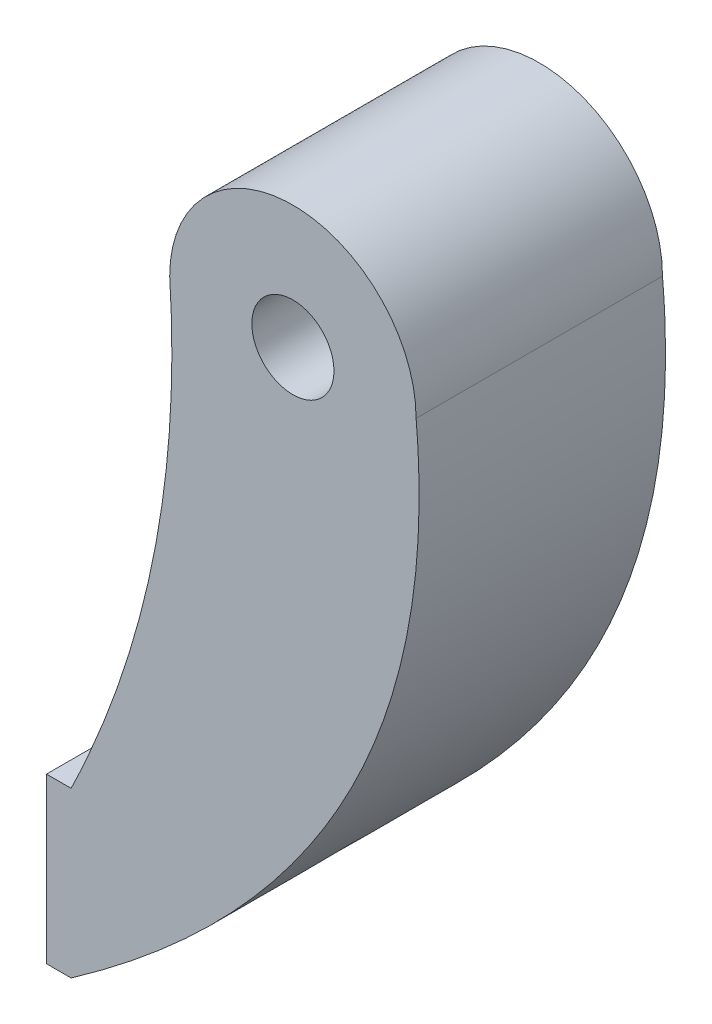
ISO-10303-21;
HEADER;
FILE_DESCRIPTION(('STEP AP214'),'2;1');
FILE_NAME('part.step','',(''),(''),'','','');
FILE_SCHEMA(('AUTOMOTIVE_DESIGN { 1 0 10303 214 1 1 1 1 }'));
ENDSEC;
DATA;
#1=APPLICATION_CONTEXT('core data for automotive mechanical design processes');
#2=APPLICATION_PROTOCOL_DEFINITION('international standard','automotive_design',2000,#1);
#3=PRODUCT_CONTEXT('',#1,'mechanical');
#4=PRODUCT('Part','Part','',(#3));
#5=PRODUCT_RELATED_PRODUCT_CATEGORY('part','',(#4));
#6=PRODUCT_DEFINITION_FORMATION('','',#4);
#7=PRODUCT_DEFINITION_CONTEXT('part definition',#1,'design');
#8=PRODUCT_DEFINITION('design','',#6,#7);
#9=PRODUCT_DEFINITION_SHAPE('','',#8);
#10=(LENGTH_UNIT() NAMED_UNIT(*) SI_UNIT(.MILLI.,.METRE.));
#11=(NAMED_UNIT(*) PLANE_ANGLE_UNIT() SI_UNIT($,.RADIAN.));
#12=(NAMED_UNIT(*) SI_UNIT($,.STERADIAN.) SOLID_ANGLE_UNIT());
#13=UNCERTAINTY_MEASURE_WITH_UNIT(LENGTH_MEASURE(1.E-05),#10,'distance_accuracy_value','');
#14=(GEOMETRIC_REPRESENTATION_CONTEXT(3) GLOBAL_UNCERTAINTY_ASSIGNED_CONTEXT((#13)) GLOBAL_UNIT_ASSIGNED_CONTEXT((#10,
#11,#12)) REPRESENTATION_CONTEXT('',''));
#15=CARTESIAN_POINT('',(0.,0.,0.));
#16=DIRECTION('',(0.,0.,1.));
#17=DIRECTION('',(1.,0.,0.));
#18=AXIS2_PLACEMENT_3D('',#15,#16,#17);
#19=CARTESIAN_POINT('',(-13.5,-40.,15.));
#20=CARTESIAN_POINT('',(9.66381145844059,-23.7748083757911,15.));
#21=CARTESIAN_POINT('',(7.5,0.,15.));
#22=B_SPLINE_CURVE_WITH_KNOTS('',2,(#19,#20,#21),.UNSPECIFIED.,.F.,.F.,(3,3),(0.,1.),.UNSPECIFIED.);
#23=DIRECTION('',(0.,0.,-1.));
#24=VECTOR('',#23,1.);
#25=SURFACE_OF_LINEAR_EXTRUSION('',#22,#24);
#26=CARTESIAN_POINT('',(-13.5,-40.,0.));
#27=CARTESIAN_POINT('',(9.66381145844059,-23.7748083757911,0.));
#28=CARTESIAN_POINT('',(7.5,0.,0.));
#29=B_SPLINE_CURVE_WITH_KNOTS('',2,(#26,#27,#28),.UNSPECIFIED.,.F.,.F.,(3,3),(0.,1.),.UNSPECIFIED.);
#30=CARTESIAN_POINT('',(-13.5,-40.,0.));
#31=VERTEX_POINT('',#30);
#32=CARTESIAN_POINT('',(7.5,0.,0.));
#33=VERTEX_POINT('',#32);
#34=EDGE_CURVE('E122',#31,#33,#29,.T.);
#35=ORIENTED_EDGE('',*,*,#34,.T.);
#36=DIRECTION('',(0.,0.,-1.));
#37=VECTOR('',#36,1.);
#38=CARTESIAN_POINT('',(7.5,0.,15.));
#39=LINE('',#38,#37);
#40=CARTESIAN_POINT('',(7.5,0.,15.));
#41=VERTEX_POINT('',#40);
#42=EDGE_CURVE('E11',#41,#33,#39,.T.);
#43=ORIENTED_EDGE('',*,*,#42,.F.);
#44=CARTESIAN_POINT('',(-13.5,-40.,15.));
#45=VERTEX_POINT('',#44);
#46=EDGE_CURVE('E143',#45,#41,#22,.T.);
#47=ORIENTED_EDGE('',*,*,#46,.F.);
#48=DIRECTION('',(0.,0.,-1.));
#49=VECTOR('',#48,1.);
#50=CARTESIAN_POINT('',(-13.5,-40.,15.));
#51=LINE('',#50,#49);
#52=EDGE_CURVE('E118',#45,#31,#51,.T.);
#53=ORIENTED_EDGE('',*,*,#52,.T.);
#54=EDGE_LOOP('',(#35,#43,#47,#53));
#55=FACE_BOUND('',#54,.T.);
#56=ADVANCED_FACE('F37',(#55),#25,.F.);
#57=CARTESIAN_POINT('',(0.,0.,15.));
#58=DIRECTION('',(0.,0.,-1.));
#59=DIRECTION('',(-1.,0.,0.));
#60=AXIS2_PLACEMENT_3D('',#57,#58,#59);
#61=CYLINDRICAL_SURFACE('',#60,7.5);
#62=CARTESIAN_POINT('',(0.,0.,0.));
#63=DIRECTION('',(0.,0.,1.));
#64=DIRECTION('',(1.,0.,0.));
#65=AXIS2_PLACEMENT_3D('',#62,#63,#64);
#66=CIRCLE('',#65,7.5);
#67=CARTESIAN_POINT('',(-7.5,0.,0.));
#68=VERTEX_POINT('',#67);
#69=EDGE_CURVE('E127',#33,#68,#66,.T.);
#70=ORIENTED_EDGE('',*,*,#69,.T.);
#71=DIRECTION('',(0.,0.,-1.));
#72=VECTOR('',#71,1.);
#73=CARTESIAN_POINT('',(-7.5,0.,15.));
#74=LINE('',#73,#72);
#75=CARTESIAN_POINT('',(-7.5,0.,15.));
#76=VERTEX_POINT('',#75);
#77=EDGE_CURVE('E46',#76,#68,#74,.T.);
#78=ORIENTED_EDGE('',*,*,#77,.F.);
#79=CARTESIAN_POINT('',(0.,0.,15.));
#80=DIRECTION('',(0.,0.,1.));
#81=DIRECTION('',(1.,0.,0.));
#82=AXIS2_PLACEMENT_3D('',#79,#80,#81);
#83=CIRCLE('',#82,7.5);
#84=EDGE_CURVE('E91',#41,#76,#83,.T.);
#85=ORIENTED_EDGE('',*,*,#84,.F.);
#86=ORIENTED_EDGE('',*,*,#42,.T.);
#87=EDGE_LOOP('',(#70,#78,#85,#86));
#88=FACE_BOUND('',#87,.T.);
#89=ADVANCED_FACE('F168',(#88),#61,.T.);
#90=CARTESIAN_POINT('',(-7.5,0.,15.));
#91=CARTESIAN_POINT('',(-6.46433399502891,-15.5381872351219,15.));
#92=CARTESIAN_POINT('',(-13.5,-30.,15.));
#93=B_SPLINE_CURVE_WITH_KNOTS('',2,(#90,#91,#92),.UNSPECIFIED.,.F.,.F.,(3,3),(0.,1.),.UNSPECIFIED.);
#94=DIRECTION('',(0.,0.,-1.));
#95=VECTOR('',#94,1.);
#96=SURFACE_OF_LINEAR_EXTRUSION('',#93,#95);
#97=CARTESIAN_POINT('',(-7.5,0.,0.));
#98=CARTESIAN_POINT('',(-6.46433399502891,-15.5381872351219,0.));
#99=CARTESIAN_POINT('',(-13.5,-30.,0.));
#100=B_SPLINE_CURVE_WITH_KNOTS('',2,(#97,#98,#99),.UNSPECIFIED.,.F.,.F.,(3,3),(0.,1.),.UNSPECIFIED.);
#101=CARTESIAN_POINT('',(-13.5,-30.,0.));
#102=VERTEX_POINT('',#101);
#103=EDGE_CURVE('E133',#68,#102,#100,.T.);
#104=ORIENTED_EDGE('',*,*,#103,.T.);
#105=DIRECTION('',(0.,0.,-1.));
#106=VECTOR('',#105,1.);
#107=CARTESIAN_POINT('',(-13.5,-30.,15.));
#108=LINE('',#107,#106);
#109=CARTESIAN_POINT('',(-13.5,-30.,15.));
#110=VERTEX_POINT('',#109);
#111=EDGE_CURVE('E113',#110,#102,#108,.T.);
#112=ORIENTED_EDGE('',*,*,#111,.F.);
#113=EDGE_CURVE('E104',#76,#110,#93,.T.);
#114=ORIENTED_EDGE('',*,*,#113,.F.);
#115=ORIENTED_EDGE('',*,*,#77,.T.);
#116=EDGE_LOOP('',(#104,#112,#114,#115));
#117=FACE_BOUND('',#116,.T.);
#118=ADVANCED_FACE('F149',(#117),#96,.F.);
#119=CARTESIAN_POINT('',(-15.,-30.,15.));
#120=DIRECTION('',(0.,-1.,0.));
#121=DIRECTION('',(0.,0.,-1.));
#122=AXIS2_PLACEMENT_3D('',#119,#120,#121);
#123=PLANE('',#122);
#124=DIRECTION('',(-1.,0.,0.));
#125=VECTOR('',#124,1.);
#126=CARTESIAN_POINT('',(-15.,-30.,0.));
#127=LINE('',#126,#125);
#128=CARTESIAN_POINT('',(-15.,-30.,0.));
#129=VERTEX_POINT('',#128);
#130=EDGE_CURVE('E112',#102,#129,#127,.T.);
#131=ORIENTED_EDGE('',*,*,#130,.T.);
#132=DIRECTION('',(0.,0.,-1.));
#133=VECTOR('',#132,1.);
#134=CARTESIAN_POINT('',(-15.,-30.,15.));
#135=LINE('',#134,#133);
#136=CARTESIAN_POINT('',(-15.,-30.,15.));
#137=VERTEX_POINT('',#136);
#138=EDGE_CURVE('E109',#137,#129,#135,.T.);
#139=ORIENTED_EDGE('',*,*,#138,.F.);
#140=DIRECTION('',(-1.,0.,0.));
#141=VECTOR('',#140,1.);
#142=CARTESIAN_POINT('',(-15.,-30.,15.));
#143=LINE('',#142,#141);
#144=EDGE_CURVE('E98',#110,#137,#143,.T.);
#145=ORIENTED_EDGE('',*,*,#144,.F.);
#146=ORIENTED_EDGE('',*,*,#111,.T.);
#147=EDGE_LOOP('',(#131,#139,#145,#146));
#148=FACE_BOUND('',#147,.T.);
#149=ADVANCED_FACE('F110',(#148),#123,.F.);
#150=CARTESIAN_POINT('',(-15.,-40.,15.));
#151=DIRECTION('',(1.,0.,0.));
#152=DIRECTION('',(0.,0.,-1.));
#153=AXIS2_PLACEMENT_3D('',#150,#151,#152);
#154=PLANE('',#153);
#155=DIRECTION('',(0.,-1.,0.));
#156=VECTOR('',#155,1.);
#157=CARTESIAN_POINT('',(-15.,-40.,0.));
#158=LINE('',#157,#156);
#159=CARTESIAN_POINT('',(-15.,-40.,0.));
#160=VERTEX_POINT('',#159);
#161=EDGE_CURVE('E77',#129,#160,#158,.T.);
#162=ORIENTED_EDGE('',*,*,#161,.T.);
#163=DIRECTION('',(0.,0.,-1.));
#164=VECTOR('',#163,1.);
#165=CARTESIAN_POINT('',(-15.,-40.,15.));
#166=LINE('',#165,#164);
#167=CARTESIAN_POINT('',(-15.,-40.,15.));
#168=VERTEX_POINT('',#167);
#169=EDGE_CURVE('E114',#168,#160,#166,.T.);
#170=ORIENTED_EDGE('',*,*,#169,.F.);
#171=DIRECTION('',(0.,-1.,0.));
#172=VECTOR('',#171,1.);
#173=CARTESIAN_POINT('',(-15.,-40.,15.));
#174=LINE('',#173,#172);
#175=EDGE_CURVE('E102',#137,#168,#174,.T.);
#176=ORIENTED_EDGE('',*,*,#175,.F.);
#177=ORIENTED_EDGE('',*,*,#138,.T.);
#178=EDGE_LOOP('',(#162,#170,#176,#177));
#179=FACE_BOUND('',#178,.T.);
#180=ADVANCED_FACE('F116',(#179),#154,.F.);
#181=CARTESIAN_POINT('',(-15.,-40.,15.));
#182=DIRECTION('',(0.,1.,0.));
#183=DIRECTION('',(0.,0.,1.));
#184=AXIS2_PLACEMENT_3D('',#181,#182,#183);
#185=PLANE('',#184);
#186=DIRECTION('',(1.,0.,0.));
#187=VECTOR('',#186,1.);
#188=CARTESIAN_POINT('',(-15.,-40.,0.));
#189=LINE('',#188,#187);
#190=EDGE_CURVE('E83',#160,#31,#189,.T.);
#191=ORIENTED_EDGE('',*,*,#190,.T.);
#192=ORIENTED_EDGE('',*,*,#52,.F.);
#193=DIRECTION('',(1.,0.,0.));
#194=VECTOR('',#193,1.);
#195=CARTESIAN_POINT('',(-15.,-40.,15.));
#196=LINE('',#195,#194);
#197=EDGE_CURVE('E54',#168,#45,#196,.T.);
#198=ORIENTED_EDGE('',*,*,#197,.F.);
#199=ORIENTED_EDGE('',*,*,#169,.T.);
#200=EDGE_LOOP('',(#191,#192,#198,#199));
#201=FACE_BOUND('',#200,.T.);
#202=ADVANCED_FACE('F156',(#201),#185,.F.);
#203=CARTESIAN_POINT('',(3.33190572922029,-21.8874041878956,15.));
#204=DIRECTION('',(0.,0.,1.));
#205=DIRECTION('',(1.,0.,0.));
#206=AXIS2_PLACEMENT_3D('',#203,#204,#205);
#207=PLANE('',#206);
#208=CARTESIAN_POINT('',(0.,0.,15.));
#209=DIRECTION('',(0.,0.,1.));
#210=DIRECTION('',(1.,0.,0.));
#211=AXIS2_PLACEMENT_3D('',#208,#209,#210);
#212=CIRCLE('',#211,2.5);
#213=CARTESIAN_POINT('',(2.5,0.,15.));
#214=VERTEX_POINT('',#213);
#215=EDGE_CURVE('E128',#214,#214,#212,.T.);
#216=ORIENTED_EDGE('',*,*,#215,.F.);
#217=EDGE_LOOP('',(#216));
#218=FACE_BOUND('',#217,.T.);
#219=ORIENTED_EDGE('',*,*,#46,.T.);
#220=ORIENTED_EDGE('',*,*,#84,.T.);
#221=ORIENTED_EDGE('',*,*,#113,.T.);
#222=ORIENTED_EDGE('',*,*,#144,.T.);
#223=ORIENTED_EDGE('',*,*,#175,.T.);
#224=ORIENTED_EDGE('',*,*,#197,.T.);
#225=EDGE_LOOP('',(#219,#220,#221,#222,#223,#224));
#226=FACE_BOUND('',#225,.T.);
#227=ADVANCED_FACE('F100',(#218,#226),#207,.T.);
#228=CARTESIAN_POINT('',(3.33190572922029,-21.8874041878956,0.));
#229=DIRECTION('',(0.,0.,1.));
#230=DIRECTION('',(1.,0.,0.));
#231=AXIS2_PLACEMENT_3D('',#228,#229,#230);
#232=PLANE('',#231);
#233=CARTESIAN_POINT('',(0.,0.,0.));
#234=DIRECTION('',(0.,0.,1.));
#235=DIRECTION('',(1.,0.,0.));
#236=AXIS2_PLACEMENT_3D('',#233,#234,#235);
#237=CIRCLE('',#236,2.5);
#238=CARTESIAN_POINT('',(2.5,0.,0.));
#239=VERTEX_POINT('',#238);
#240=EDGE_CURVE('E193',#239,#239,#237,.T.);
#241=ORIENTED_EDGE('',*,*,#240,.T.);
#242=EDGE_LOOP('',(#241));
#243=FACE_BOUND('',#242,.T.);
#244=ORIENTED_EDGE('',*,*,#34,.F.);
#245=ORIENTED_EDGE('',*,*,#190,.F.);
#246=ORIENTED_EDGE('',*,*,#161,.F.);
#247=ORIENTED_EDGE('',*,*,#130,.F.);
#248=ORIENTED_EDGE('',*,*,#103,.F.);
#249=ORIENTED_EDGE('',*,*,#69,.F.);
#250=EDGE_LOOP('',(#244,#245,#246,#247,#248,#249));
#251=FACE_BOUND('',#250,.T.);
#252=ADVANCED_FACE('F152',(#243,#251),#232,.F.);
#253=CARTESIAN_POINT('',(0.,0.,0.));
#254=DIRECTION('',(0.,0.,1.));
#255=DIRECTION('',(1.,0.,0.));
#256=AXIS2_PLACEMENT_3D('',#253,#254,#255);
#257=CYLINDRICAL_SURFACE('',#256,2.5);
#258=ORIENTED_EDGE('',*,*,#215,.T.);
#259=EDGE_LOOP('',(#258));
#260=FACE_BOUND('',#259,.T.);
#261=ORIENTED_EDGE('',*,*,#240,.F.);
#262=EDGE_LOOP('',(#261));
#263=FACE_BOUND('',#262,.T.);
#264=ADVANCED_FACE('F198',(#260,#263),#257,.F.);
#265=CLOSED_SHELL('',(#56,#89,#118,#149,#180,#202,#227,#252,#264));
#266=MANIFOLD_SOLID_BREP('B2',#265);
#267=ADVANCED_BREP_SHAPE_REPRESENTATION('',(#18,#266),#14);
#268=SHAPE_DEFINITION_REPRESENTATION(#9,#267);
ENDSEC;
END-ISO-10303-21;
